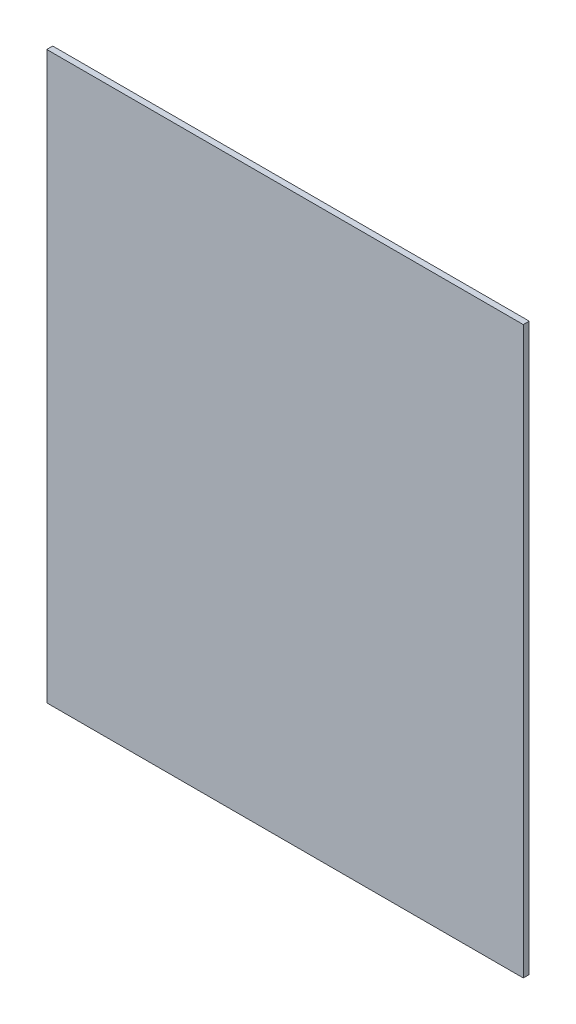
ISO-10303-21;
HEADER;
FILE_DESCRIPTION(('STEP AP214'),'2;1');
FILE_NAME('part.step','',(''),(''),'','','');
FILE_SCHEMA(('AUTOMOTIVE_DESIGN { 1 0 10303 214 1 1 1 1 }'));
ENDSEC;
DATA;
#1=APPLICATION_CONTEXT('core data for automotive mechanical design processes');
#2=APPLICATION_PROTOCOL_DEFINITION('international standard','automotive_design',2000,#1);
#3=PRODUCT_CONTEXT('',#1,'mechanical');
#4=PRODUCT('Part','Part','',(#3));
#5=PRODUCT_RELATED_PRODUCT_CATEGORY('part','',(#4));
#6=PRODUCT_DEFINITION_FORMATION('','',#4);
#7=PRODUCT_DEFINITION_CONTEXT('part definition',#1,'design');
#8=PRODUCT_DEFINITION('design','',#6,#7);
#9=PRODUCT_DEFINITION_SHAPE('','',#8);
#10=(LENGTH_UNIT() NAMED_UNIT(*) SI_UNIT(.MILLI.,.METRE.));
#11=(NAMED_UNIT(*) PLANE_ANGLE_UNIT() SI_UNIT($,.RADIAN.));
#12=(NAMED_UNIT(*) SI_UNIT($,.STERADIAN.) SOLID_ANGLE_UNIT());
#13=UNCERTAINTY_MEASURE_WITH_UNIT(LENGTH_MEASURE(1.E-05),#10,'distance_accuracy_value','');
#14=(GEOMETRIC_REPRESENTATION_CONTEXT(3) GLOBAL_UNCERTAINTY_ASSIGNED_CONTEXT((#13)) GLOBAL_UNIT_ASSIGNED_CONTEXT((#10,
#11,#12)) REPRESENTATION_CONTEXT('',''));
#15=CARTESIAN_POINT('',(0.,0.,0.));
#16=DIRECTION('',(0.,0.,1.));
#17=DIRECTION('',(1.,0.,0.));
#18=AXIS2_PLACEMENT_3D('',#15,#16,#17);
#19=CARTESIAN_POINT('',(0.,0.,0.01));
#20=DIRECTION('',(0.,0.,1.));
#21=DIRECTION('',(1.,0.,0.));
#22=AXIS2_PLACEMENT_3D('',#19,#20,#21);
#23=PLANE('',#22);
#24=DIRECTION('',(0.,-1.,0.));
#25=VECTOR('',#24,1.);
#26=CARTESIAN_POINT('',(-0.4,0.475,0.01));
#27=LINE('',#26,#25);
#28=CARTESIAN_POINT('',(-0.4,0.475,0.01));
#29=VERTEX_POINT('',#28);
#30=CARTESIAN_POINT('',(-0.4,-0.475,0.01));
#31=VERTEX_POINT('',#30);
#32=EDGE_CURVE('E89',#29,#31,#27,.T.);
#33=ORIENTED_EDGE('',*,*,#32,.T.);
#34=DIRECTION('',(1.,0.,0.));
#35=VECTOR('',#34,1.);
#36=CARTESIAN_POINT('',(-0.4,-0.475,0.01));
#37=LINE('',#36,#35);
#38=CARTESIAN_POINT('',(0.4,-0.475,0.01));
#39=VERTEX_POINT('',#38);
#40=EDGE_CURVE('E95',#31,#39,#37,.T.);
#41=ORIENTED_EDGE('',*,*,#40,.T.);
#42=DIRECTION('',(0.,1.,0.));
#43=VECTOR('',#42,1.);
#44=CARTESIAN_POINT('',(0.4,-0.475,0.01));
#45=LINE('',#44,#43);
#46=CARTESIAN_POINT('',(0.4,0.475,0.01));
#47=VERTEX_POINT('',#46);
#48=EDGE_CURVE('E74',#39,#47,#45,.T.);
#49=ORIENTED_EDGE('',*,*,#48,.T.);
#50=DIRECTION('',(-1.,0.,0.));
#51=VECTOR('',#50,1.);
#52=CARTESIAN_POINT('',(0.4,0.475,0.01));
#53=LINE('',#52,#51);
#54=EDGE_CURVE('E11',#47,#29,#53,.T.);
#55=ORIENTED_EDGE('',*,*,#54,.T.);
#56=EDGE_LOOP('',(#33,#41,#49,#55));
#57=FACE_BOUND('',#56,.T.);
#58=ADVANCED_FACE('F17',(#57),#23,.T.);
#59=CARTESIAN_POINT('',(0.,0.,0.));
#60=DIRECTION('',(0.,0.,1.));
#61=DIRECTION('',(1.,0.,0.));
#62=AXIS2_PLACEMENT_3D('',#59,#60,#61);
#63=PLANE('',#62);
#64=DIRECTION('',(0.,-1.,0.));
#65=VECTOR('',#64,1.);
#66=CARTESIAN_POINT('',(-0.4,0.475,0.));
#67=LINE('',#66,#65);
#68=CARTESIAN_POINT('',(-0.4,0.475,0.));
#69=VERTEX_POINT('',#68);
#70=CARTESIAN_POINT('',(-0.4,-0.475,0.));
#71=VERTEX_POINT('',#70);
#72=EDGE_CURVE('E76',#69,#71,#67,.T.);
#73=ORIENTED_EDGE('',*,*,#72,.F.);
#74=DIRECTION('',(-1.,0.,0.));
#75=VECTOR('',#74,1.);
#76=CARTESIAN_POINT('',(0.4,0.475,0.));
#77=LINE('',#76,#75);
#78=CARTESIAN_POINT('',(0.4,0.475,0.));
#79=VERTEX_POINT('',#78);
#80=EDGE_CURVE('E20',#79,#69,#77,.T.);
#81=ORIENTED_EDGE('',*,*,#80,.F.);
#82=DIRECTION('',(0.,1.,0.));
#83=VECTOR('',#82,1.);
#84=CARTESIAN_POINT('',(0.4,-0.475,0.));
#85=LINE('',#84,#83);
#86=CARTESIAN_POINT('',(0.4,-0.475,0.));
#87=VERTEX_POINT('',#86);
#88=EDGE_CURVE('E97',#87,#79,#85,.T.);
#89=ORIENTED_EDGE('',*,*,#88,.F.);
#90=DIRECTION('',(1.,0.,0.));
#91=VECTOR('',#90,1.);
#92=CARTESIAN_POINT('',(-0.4,-0.475,0.));
#93=LINE('',#92,#91);
#94=EDGE_CURVE('E79',#71,#87,#93,.T.);
#95=ORIENTED_EDGE('',*,*,#94,.F.);
#96=EDGE_LOOP('',(#73,#81,#89,#95));
#97=FACE_BOUND('',#96,.T.);
#98=ADVANCED_FACE('F77',(#97),#63,.F.);
#99=CARTESIAN_POINT('',(0.4,0.475,0.));
#100=DIRECTION('',(0.,-1.,0.));
#101=DIRECTION('',(0.,0.,-1.));
#102=AXIS2_PLACEMENT_3D('',#99,#100,#101);
#103=PLANE('',#102);
#104=DIRECTION('',(0.,0.,1.));
#105=VECTOR('',#104,1.);
#106=CARTESIAN_POINT('',(0.4,0.475,0.));
#107=LINE('',#106,#105);
#108=EDGE_CURVE('E71',#79,#47,#107,.T.);
#109=ORIENTED_EDGE('',*,*,#108,.F.);
#110=ORIENTED_EDGE('',*,*,#80,.T.);
#111=DIRECTION('',(0.,0.,1.));
#112=VECTOR('',#111,1.);
#113=CARTESIAN_POINT('',(-0.4,0.475,0.));
#114=LINE('',#113,#112);
#115=EDGE_CURVE('E69',#69,#29,#114,.T.);
#116=ORIENTED_EDGE('',*,*,#115,.T.);
#117=ORIENTED_EDGE('',*,*,#54,.F.);
#118=EDGE_LOOP('',(#109,#110,#116,#117));
#119=FACE_BOUND('',#118,.T.);
#120=ADVANCED_FACE('F67',(#119),#103,.F.);
#121=CARTESIAN_POINT('',(0.4,-0.475,0.));
#122=DIRECTION('',(-1.,0.,0.));
#123=DIRECTION('',(0.,0.,1.));
#124=AXIS2_PLACEMENT_3D('',#121,#122,#123);
#125=PLANE('',#124);
#126=DIRECTION('',(0.,0.,1.));
#127=VECTOR('',#126,1.);
#128=CARTESIAN_POINT('',(0.4,-0.475,0.));
#129=LINE('',#128,#127);
#130=EDGE_CURVE('E98',#87,#39,#129,.T.);
#131=ORIENTED_EDGE('',*,*,#130,.F.);
#132=ORIENTED_EDGE('',*,*,#88,.T.);
#133=ORIENTED_EDGE('',*,*,#108,.T.);
#134=ORIENTED_EDGE('',*,*,#48,.F.);
#135=EDGE_LOOP('',(#131,#132,#133,#134));
#136=FACE_BOUND('',#135,.T.);
#137=ADVANCED_FACE('F117',(#136),#125,.F.);
#138=CARTESIAN_POINT('',(-0.4,-0.475,0.));
#139=DIRECTION('',(0.,1.,0.));
#140=DIRECTION('',(1.,0.,0.));
#141=AXIS2_PLACEMENT_3D('',#138,#139,#140);
#142=PLANE('',#141);
#143=DIRECTION('',(0.,0.,1.));
#144=VECTOR('',#143,1.);
#145=CARTESIAN_POINT('',(-0.4,-0.475,0.));
#146=LINE('',#145,#144);
#147=EDGE_CURVE('E84',#71,#31,#146,.T.);
#148=ORIENTED_EDGE('',*,*,#147,.F.);
#149=ORIENTED_EDGE('',*,*,#94,.T.);
#150=ORIENTED_EDGE('',*,*,#130,.T.);
#151=ORIENTED_EDGE('',*,*,#40,.F.);
#152=EDGE_LOOP('',(#148,#149,#150,#151));
#153=FACE_BOUND('',#152,.T.);
#154=ADVANCED_FACE('F119',(#153),#142,.F.);
#155=CARTESIAN_POINT('',(-0.4,0.475,0.));
#156=DIRECTION('',(1.,0.,0.));
#157=DIRECTION('',(0.,1.,0.));
#158=AXIS2_PLACEMENT_3D('',#155,#156,#157);
#159=PLANE('',#158);
#160=ORIENTED_EDGE('',*,*,#115,.F.);
#161=ORIENTED_EDGE('',*,*,#72,.T.);
#162=ORIENTED_EDGE('',*,*,#147,.T.);
#163=ORIENTED_EDGE('',*,*,#32,.F.);
#164=EDGE_LOOP('',(#160,#161,#162,#163));
#165=FACE_BOUND('',#164,.T.);
#166=ADVANCED_FACE('F87',(#165),#159,.F.);
#167=CLOSED_SHELL('',(#58,#98,#120,#137,#154,#166));
#168=MANIFOLD_SOLID_BREP('B1',#167);
#169=ADVANCED_BREP_SHAPE_REPRESENTATION('',(#18,#168),#14);
#170=SHAPE_DEFINITION_REPRESENTATION(#9,#169);
ENDSEC;
END-ISO-10303-21;
